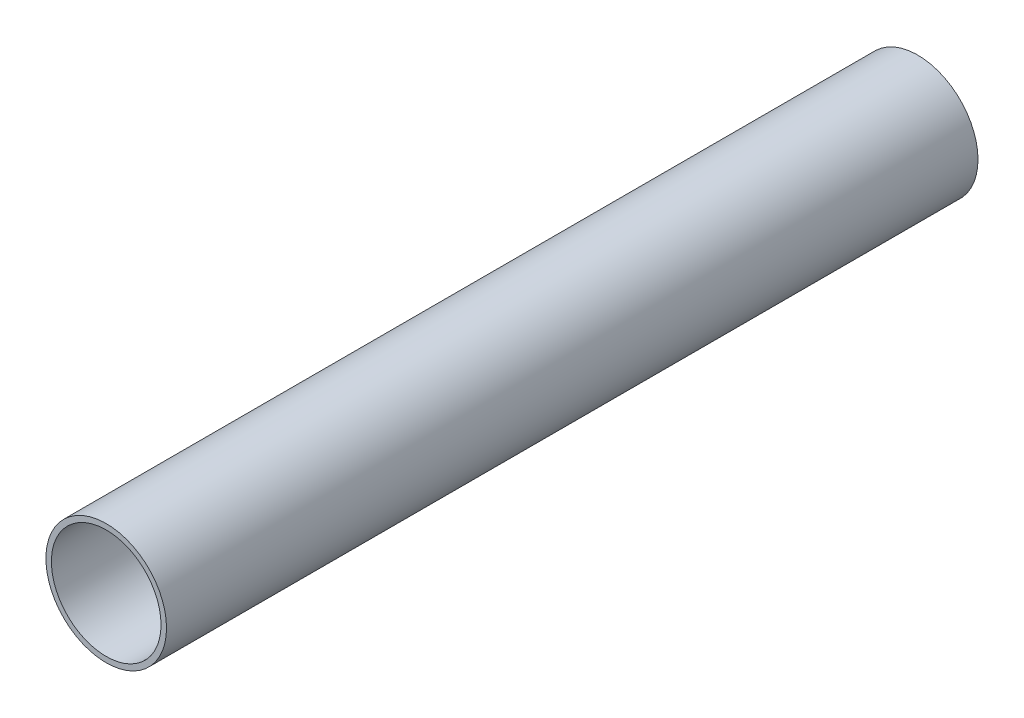
ISO-10303-21;
HEADER;
FILE_DESCRIPTION(('STEP AP214'),'2;1');
FILE_NAME('part.step','',(''),(''),'','','');
FILE_SCHEMA(('AUTOMOTIVE_DESIGN { 1 0 10303 214 1 1 1 1 }'));
ENDSEC;
DATA;
#1=APPLICATION_CONTEXT('core data for automotive mechanical design processes');
#2=APPLICATION_PROTOCOL_DEFINITION('international standard','automotive_design',2000,#1);
#3=PRODUCT_CONTEXT('',#1,'mechanical');
#4=PRODUCT('Part','Part','',(#3));
#5=PRODUCT_RELATED_PRODUCT_CATEGORY('part','',(#4));
#6=PRODUCT_DEFINITION_FORMATION('','',#4);
#7=PRODUCT_DEFINITION_CONTEXT('part definition',#1,'design');
#8=PRODUCT_DEFINITION('design','',#6,#7);
#9=PRODUCT_DEFINITION_SHAPE('','',#8);
#10=(LENGTH_UNIT() NAMED_UNIT(*) SI_UNIT(.MILLI.,.METRE.));
#11=(NAMED_UNIT(*) PLANE_ANGLE_UNIT() SI_UNIT($,.RADIAN.));
#12=(NAMED_UNIT(*) SI_UNIT($,.STERADIAN.) SOLID_ANGLE_UNIT());
#13=UNCERTAINTY_MEASURE_WITH_UNIT(LENGTH_MEASURE(1.E-05),#10,'distance_accuracy_value','');
#14=(GEOMETRIC_REPRESENTATION_CONTEXT(3) GLOBAL_UNCERTAINTY_ASSIGNED_CONTEXT((#13)) GLOBAL_UNIT_ASSIGNED_CONTEXT((#10,
#11,#12)) REPRESENTATION_CONTEXT('',''));
#15=CARTESIAN_POINT('',(0.,0.,0.));
#16=DIRECTION('',(0.,0.,1.));
#17=DIRECTION('',(1.,0.,0.));
#18=AXIS2_PLACEMENT_3D('',#15,#16,#17);
#19=CARTESIAN_POINT('',(0.,0.,234.95));
#20=DIRECTION('',(0.,0.,1.));
#21=DIRECTION('',(1.,0.,0.));
#22=AXIS2_PLACEMENT_3D('',#19,#20,#21);
#23=PLANE('',#22);
#24=CARTESIAN_POINT('',(0.,0.,234.95));
#25=DIRECTION('',(0.,0.,1.));
#26=DIRECTION('',(1.,0.,0.));
#27=AXIS2_PLACEMENT_3D('',#24,#25,#26);
#28=CIRCLE('',#27,34.925);
#29=CARTESIAN_POINT('',(34.925,0.,234.95));
#30=VERTEX_POINT('',#29);
#31=EDGE_CURVE('E10',#30,#30,#28,.T.);
#32=ORIENTED_EDGE('',*,*,#31,.T.);
#33=EDGE_LOOP('',(#32));
#34=FACE_BOUND('',#33,.T.);
#35=CARTESIAN_POINT('',(0.,0.,234.95));
#36=DIRECTION('',(0.,0.,1.));
#37=DIRECTION('',(1.,0.,0.));
#38=AXIS2_PLACEMENT_3D('',#35,#36,#37);
#39=CIRCLE('',#38,31.75);
#40=CARTESIAN_POINT('',(31.75,0.,234.95));
#41=VERTEX_POINT('',#40);
#42=EDGE_CURVE('E52',#41,#41,#39,.T.);
#43=ORIENTED_EDGE('',*,*,#42,.F.);
#44=EDGE_LOOP('',(#43));
#45=FACE_BOUND('',#44,.T.);
#46=ADVANCED_FACE('F39',(#34,#45),#23,.T.);
#47=CARTESIAN_POINT('',(0.,0.,-234.95));
#48=DIRECTION('',(0.,0.,1.));
#49=DIRECTION('',(1.,0.,0.));
#50=AXIS2_PLACEMENT_3D('',#47,#48,#49);
#51=PLANE('',#50);
#52=CARTESIAN_POINT('',(0.,0.,-234.95));
#53=DIRECTION('',(0.,0.,1.));
#54=DIRECTION('',(1.,0.,0.));
#55=AXIS2_PLACEMENT_3D('',#52,#53,#54);
#56=CIRCLE('',#55,34.925);
#57=CARTESIAN_POINT('',(34.925,0.,-234.95));
#58=VERTEX_POINT('',#57);
#59=EDGE_CURVE('E43',#58,#58,#56,.T.);
#60=ORIENTED_EDGE('',*,*,#59,.F.);
#61=EDGE_LOOP('',(#60));
#62=FACE_BOUND('',#61,.T.);
#63=CARTESIAN_POINT('',(0.,0.,-234.95));
#64=DIRECTION('',(0.,0.,1.));
#65=DIRECTION('',(1.,0.,0.));
#66=AXIS2_PLACEMENT_3D('',#63,#64,#65);
#67=CIRCLE('',#66,31.75);
#68=CARTESIAN_POINT('',(31.75,0.,-234.95));
#69=VERTEX_POINT('',#68);
#70=EDGE_CURVE('E54',#69,#69,#67,.T.);
#71=ORIENTED_EDGE('',*,*,#70,.T.);
#72=EDGE_LOOP('',(#71));
#73=FACE_BOUND('',#72,.T.);
#74=ADVANCED_FACE('F66',(#62,#73),#51,.F.);
#75=CARTESIAN_POINT('',(0.,0.,234.95));
#76=DIRECTION('',(0.,0.,-1.));
#77=DIRECTION('',(-1.,0.,0.));
#78=AXIS2_PLACEMENT_3D('',#75,#76,#77);
#79=CYLINDRICAL_SURFACE('',#78,34.925);
#80=ORIENTED_EDGE('',*,*,#31,.F.);
#81=EDGE_LOOP('',(#80));
#82=FACE_BOUND('',#81,.T.);
#83=ORIENTED_EDGE('',*,*,#59,.T.);
#84=EDGE_LOOP('',(#83));
#85=FACE_BOUND('',#84,.T.);
#86=ADVANCED_FACE('F41',(#82,#85),#79,.T.);
#87=CARTESIAN_POINT('',(0.,0.,234.95));
#88=DIRECTION('',(0.,0.,-1.));
#89=DIRECTION('',(-1.,0.,0.));
#90=AXIS2_PLACEMENT_3D('',#87,#88,#89);
#91=CYLINDRICAL_SURFACE('',#90,31.75);
#92=ORIENTED_EDGE('',*,*,#42,.T.);
#93=EDGE_LOOP('',(#92));
#94=FACE_BOUND('',#93,.T.);
#95=ORIENTED_EDGE('',*,*,#70,.F.);
#96=EDGE_LOOP('',(#95));
#97=FACE_BOUND('',#96,.T.);
#98=ADVANCED_FACE('F62',(#94,#97),#91,.F.);
#99=CLOSED_SHELL('',(#46,#74,#86,#98));
#100=MANIFOLD_SOLID_BREP('B2',#99);
#101=ADVANCED_BREP_SHAPE_REPRESENTATION('',(#18,#100),#14);
#102=SHAPE_DEFINITION_REPRESENTATION(#9,#101);
ENDSEC;
END-ISO-10303-21;
